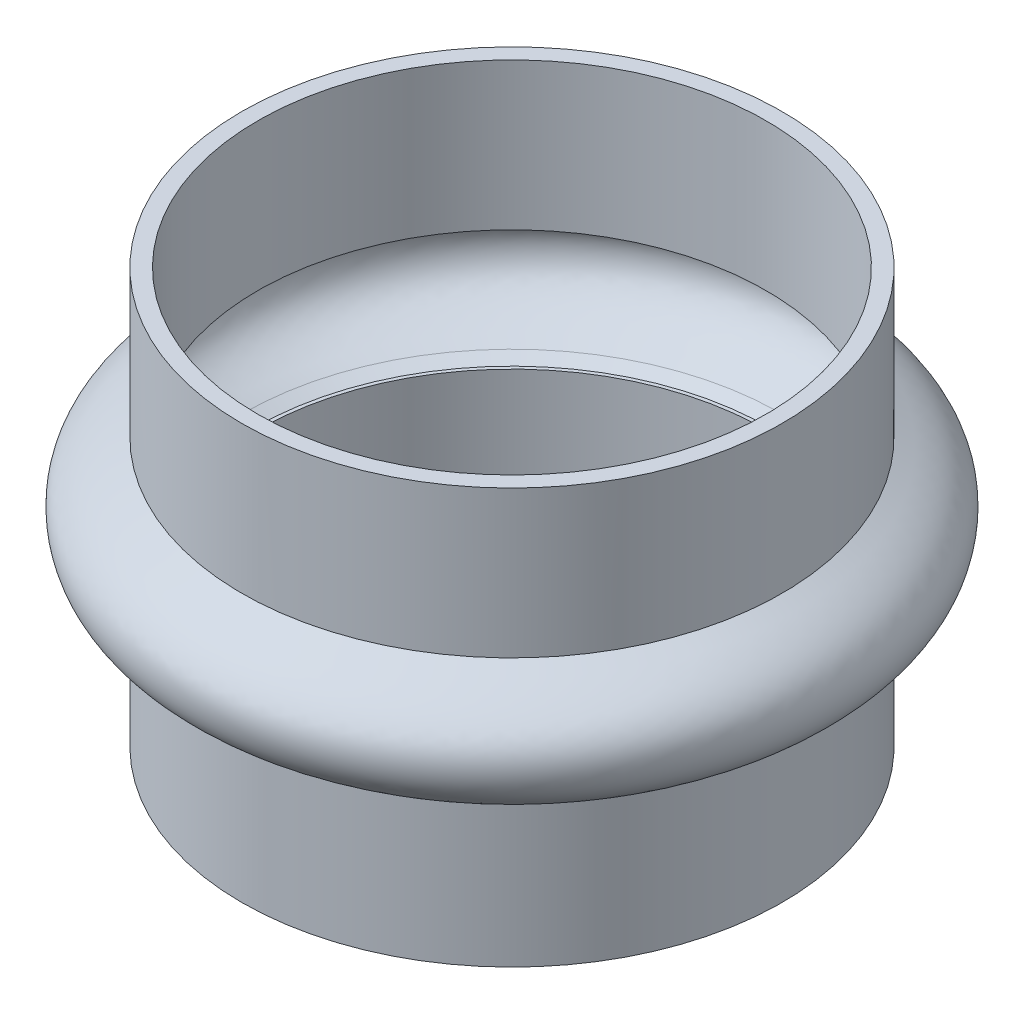
ISO-10303-21;
HEADER;
FILE_DESCRIPTION(('STEP AP214'),'2;1');
FILE_NAME('part.step','',(''),(''),'','','');
FILE_SCHEMA(('AUTOMOTIVE_DESIGN { 1 0 10303 214 1 1 1 1 }'));
ENDSEC;
DATA;
#1=APPLICATION_CONTEXT('core data for automotive mechanical design processes');
#2=APPLICATION_PROTOCOL_DEFINITION('international standard','automotive_design',2000,#1);
#3=PRODUCT_CONTEXT('',#1,'mechanical');
#4=PRODUCT('Part','Part','',(#3));
#5=PRODUCT_RELATED_PRODUCT_CATEGORY('part','',(#4));
#6=PRODUCT_DEFINITION_FORMATION('','',#4);
#7=PRODUCT_DEFINITION_CONTEXT('part definition',#1,'design');
#8=PRODUCT_DEFINITION('design','',#6,#7);
#9=PRODUCT_DEFINITION_SHAPE('','',#8);
#10=(LENGTH_UNIT() NAMED_UNIT(*) SI_UNIT(.MILLI.,.METRE.));
#11=(NAMED_UNIT(*) PLANE_ANGLE_UNIT() SI_UNIT($,.RADIAN.));
#12=(NAMED_UNIT(*) SI_UNIT($,.STERADIAN.) SOLID_ANGLE_UNIT());
#13=UNCERTAINTY_MEASURE_WITH_UNIT(LENGTH_MEASURE(1.E-05),#10,'distance_accuracy_value','');
#14=(GEOMETRIC_REPRESENTATION_CONTEXT(3) GLOBAL_UNCERTAINTY_ASSIGNED_CONTEXT((#13)) GLOBAL_UNIT_ASSIGNED_CONTEXT((#10,
#11,#12)) REPRESENTATION_CONTEXT('',''));
#15=CARTESIAN_POINT('',(0.,0.,0.));
#16=DIRECTION('',(0.,0.,1.));
#17=DIRECTION('',(1.,0.,0.));
#18=AXIS2_PLACEMENT_3D('',#15,#16,#17);
#19=CARTESIAN_POINT('',(7.32527885416046,63.4118839536714,0.));
#20=CARTESIAN_POINT('',(6.01113524448012,62.7300548837443,0.));
#21=CARTESIAN_POINT('',(2.97178340482834,61.4251647000728,0.));
#22=CARTESIAN_POINT('',(3.46335156981875,56.9126049959074,0.));
#23=CARTESIAN_POINT('',(5.94264008540045,55.867892062733,0.));
#24=CARTESIAN_POINT('',(7.13175859484,55.2111567601479,0.));
#25=B_SPLINE_CURVE_WITH_KNOTS('',3,(#19,#20,#21,#22,#23,#24),.UNSPECIFIED.,.F.,.F.,(4,1,1,4),
(0.,0.430000258288569,0.624673055244475,1.),.UNSPECIFIED.);
#26=CARTESIAN_POINT('',(25.6902788541605,76.5393428738392,0.));
#27=DIRECTION('',(0.,1.,0.));
#28=AXIS1_PLACEMENT('',#26,#27);
#29=SURFACE_OF_REVOLUTION('',#25,#28);
#30=CARTESIAN_POINT('',(25.6902788541605,55.211156760148,0.));
#31=DIRECTION('',(0.,1.,0.));
#32=DIRECTION('',(-1.,0.,0.));
#33=AXIS2_PLACEMENT_3D('',#30,#31,#32);
#34=CIRCLE('',#33,18.5585202593205);
#35=CARTESIAN_POINT('',(7.13175859484001,55.211156760148,0.));
#36=VERTEX_POINT('',#35);
#37=EDGE_CURVE('E10',#36,#36,#34,.T.);
#38=ORIENTED_EDGE('',*,*,#37,.T.);
#39=EDGE_LOOP('',(#38));
#40=FACE_BOUND('',#39,.T.);
#41=CARTESIAN_POINT('',(25.6902788541605,63.4118839536714,0.));
#42=DIRECTION('',(0.,1.,0.));
#43=DIRECTION('',(-1.,0.,0.));
#44=AXIS2_PLACEMENT_3D('',#41,#42,#43);
#45=CIRCLE('',#44,18.365);
#46=CARTESIAN_POINT('',(7.32527885416046,63.4118839536714,0.));
#47=VERTEX_POINT('',#46);
#48=EDGE_CURVE('E61',#47,#47,#45,.T.);
#49=ORIENTED_EDGE('',*,*,#48,.F.);
#50=EDGE_LOOP('',(#49));
#51=FACE_BOUND('',#50,.T.);
#52=ADVANCED_FACE('F37',(#40,#51),#29,.F.);
#53=CARTESIAN_POINT('',(8.16598021867365,55.211156760148,0.));
#54=DIRECTION('',(0.,-1.,0.));
#55=DIRECTION('',(1.,0.,0.));
#56=AXIS2_PLACEMENT_3D('',#53,#54,#55);
#57=PLANE('',#56);
#58=CARTESIAN_POINT('',(25.6902788541605,55.2111567601479,0.));
#59=DIRECTION('',(0.,1.,0.));
#60=DIRECTION('',(0.,0.,1.));
#61=AXIS2_PLACEMENT_3D('',#58,#59,#60);
#62=CIRCLE('',#61,18.365);
#63=CARTESIAN_POINT('',(25.6902788541605,55.2111567601479,18.365));
#64=VERTEX_POINT('',#63);
#65=EDGE_CURVE('E96',#64,#64,#62,.T.);
#66=ORIENTED_EDGE('',*,*,#65,.T.);
#67=EDGE_LOOP('',(#66));
#68=FACE_BOUND('',#67,.T.);
#69=ORIENTED_EDGE('',*,*,#37,.F.);
#70=EDGE_LOOP('',(#69));
#71=FACE_BOUND('',#70,.T.);
#72=ADVANCED_FACE('F86',(#68,#71),#57,.T.);
#73=CARTESIAN_POINT('',(25.6902788541605,55.211156760148,0.));
#74=DIRECTION('',(0.,1.,0.));
#75=DIRECTION('',(-1.,0.,0.));
#76=AXIS2_PLACEMENT_3D('',#73,#74,#75);
#77=CONICAL_SURFACE('',#76,17.5242986354868,1.0661985655365);
#78=CARTESIAN_POINT('',(25.6902788541605,55.6488412650065,0.));
#79=DIRECTION('',(0.,1.,0.));
#80=DIRECTION('',(-1.,0.,0.));
#81=AXIS2_PLACEMENT_3D('',#78,#79,#80);
#82=CIRCLE('',#81,18.3167925732629);
#83=CARTESIAN_POINT('',(7.37348628089757,55.6488412650065,0.));
#84=VERTEX_POINT('',#83);
#85=EDGE_CURVE('E50',#84,#84,#82,.T.);
#86=ORIENTED_EDGE('',*,*,#85,.T.);
#87=EDGE_LOOP('',(#86));
#88=FACE_BOUND('',#87,.T.);
#89=CARTESIAN_POINT('',(25.6902788541605,55.211156760148,0.));
#90=DIRECTION('',(0.,1.,0.));
#91=DIRECTION('',(-1.,0.,0.));
#92=AXIS2_PLACEMENT_3D('',#89,#90,#91);
#93=CIRCLE('',#92,17.5242986354868);
#94=CARTESIAN_POINT('',(8.16598021867365,55.211156760148,0.));
#95=VERTEX_POINT('',#94);
#96=EDGE_CURVE('E45',#95,#95,#93,.T.);
#97=ORIENTED_EDGE('',*,*,#96,.F.);
#98=EDGE_LOOP('',(#97));
#99=FACE_BOUND('',#98,.T.);
#100=ADVANCED_FACE('F82',(#88,#99),#77,.F.);
#101=CARTESIAN_POINT('',(7.37348628089757,55.6488412650065,0.));
#102=CARTESIAN_POINT('',(6.94927786526421,55.8831262752797,0.));
#103=CARTESIAN_POINT('',(6.08596344010193,56.3113793414857,0.));
#104=CARTESIAN_POINT('',(4.83183781803493,57.1065516861268,0.));
#105=CARTESIAN_POINT('',(3.98998944217818,58.0646968706636,0.));
#106=CARTESIAN_POINT('',(3.73463050414133,59.1781793514421,0.));
#107=CARTESIAN_POINT('',(3.84359558060863,60.0137583984932,0.));
#108=CARTESIAN_POINT('',(4.15954484014883,60.7257045834839,0.));
#109=CARTESIAN_POINT('',(4.95450233993011,61.5405908742814,0.));
#110=CARTESIAN_POINT('',(6.05410486957729,62.2018426288294,0.));
#111=CARTESIAN_POINT('',(6.94714467288609,62.6603874787557,0.));
#112=CARTESIAN_POINT('',(7.34999990981553,62.8614176513628,0.));
#113=CARTESIAN_POINT('',(7.55554955647946,62.9680648422606,0.));
#114=B_SPLINE_CURVE_WITH_KNOTS('',3,(#101,#102,#103,#104,#105,#106,#107,#108,#109,#110,#111,
#112,#113),.UNSPECIFIED.,.F.,.F.,(4,1,1,1,1,1,1,1,1,1,4),(0.,0.125,0.25,0.375,0.5,0.5625,0.625,
0.75,0.875,0.9375,1.),.UNSPECIFIED.);
#115=CARTESIAN_POINT('',(25.6902788541605,76.5393428738392,0.));
#116=DIRECTION('',(0.,1.,0.));
#117=AXIS1_PLACEMENT('',#115,#116);
#118=SURFACE_OF_REVOLUTION('',#114,#117);
#119=CARTESIAN_POINT('',(25.6902788541605,62.9680648422606,0.));
#120=DIRECTION('',(0.,1.,0.));
#121=DIRECTION('',(-1.,0.,0.));
#122=AXIS2_PLACEMENT_3D('',#119,#120,#121);
#123=CIRCLE('',#122,18.134729297681);
#124=CARTESIAN_POINT('',(7.55554955647946,62.9680648422606,0.));
#125=VERTEX_POINT('',#124);
#126=EDGE_CURVE('E55',#125,#125,#123,.T.);
#127=ORIENTED_EDGE('',*,*,#126,.T.);
#128=EDGE_LOOP('',(#127));
#129=FACE_BOUND('',#128,.T.);
#130=ORIENTED_EDGE('',*,*,#85,.F.);
#131=EDGE_LOOP('',(#130));
#132=FACE_BOUND('',#131,.T.);
#133=ADVANCED_FACE('F77',(#129,#132),#118,.F.);
#134=CARTESIAN_POINT('',(25.6902788541605,62.9680648422606,0.));
#135=DIRECTION('',(0.,-1.,0.));
#136=DIRECTION('',(1.,0.,0.));
#137=AXIS2_PLACEMENT_3D('',#134,#135,#136);
#138=CONICAL_SURFACE('',#137,18.134729297681,1.09219128631746);
#139=CARTESIAN_POINT('',(25.6902788541605,63.4118839536714,0.));
#140=DIRECTION('',(0.,1.,0.));
#141=DIRECTION('',(0.,0.,1.));
#142=AXIS2_PLACEMENT_3D('',#139,#140,#141);
#143=CIRCLE('',#142,17.2793212858505);
#144=CARTESIAN_POINT('',(25.6902788541605,63.4118839536714,17.2793212858505));
#145=VERTEX_POINT('',#144);
#146=EDGE_CURVE('E105',#145,#145,#143,.T.);
#147=ORIENTED_EDGE('',*,*,#146,.T.);
#148=EDGE_LOOP('',(#147));
#149=FACE_BOUND('',#148,.T.);
#150=ORIENTED_EDGE('',*,*,#126,.F.);
#151=EDGE_LOOP('',(#150));
#152=FACE_BOUND('',#151,.T.);
#153=ADVANCED_FACE('F81',(#149,#152),#138,.F.);
#154=CARTESIAN_POINT('',(25.6902788541605,73.4118839536714,0.));
#155=DIRECTION('',(0.,1.,0.));
#156=DIRECTION('',(0.,0.,1.));
#157=AXIS2_PLACEMENT_3D('',#154,#155,#156);
#158=PLANE('',#157);
#159=CARTESIAN_POINT('',(25.6902788541605,73.4118839536714,0.));
#160=DIRECTION('',(0.,1.,0.));
#161=DIRECTION('',(0.,0.,1.));
#162=AXIS2_PLACEMENT_3D('',#159,#160,#161);
#163=CIRCLE('',#162,18.365);
#164=CARTESIAN_POINT('',(25.6902788541605,73.4118839536714,18.365));
#165=VERTEX_POINT('',#164);
#166=EDGE_CURVE('E65',#165,#165,#163,.T.);
#167=ORIENTED_EDGE('',*,*,#166,.T.);
#168=EDGE_LOOP('',(#167));
#169=FACE_BOUND('',#168,.T.);
#170=CARTESIAN_POINT('',(25.6902788541605,73.4118839536714,0.));
#171=DIRECTION('',(0.,1.,0.));
#172=DIRECTION('',(0.,0.,1.));
#173=AXIS2_PLACEMENT_3D('',#170,#171,#172);
#174=CIRCLE('',#173,17.2793212858505);
#175=CARTESIAN_POINT('',(25.6902788541605,73.4118839536714,17.2793212858505));
#176=VERTEX_POINT('',#175);
#177=EDGE_CURVE('E112',#176,#176,#174,.T.);
#178=ORIENTED_EDGE('',*,*,#177,.F.);
#179=EDGE_LOOP('',(#178));
#180=FACE_BOUND('',#179,.T.);
#181=ADVANCED_FACE('F122',(#169,#180),#158,.T.);
#182=CARTESIAN_POINT('',(25.6902788541605,73.4118839536714,0.));
#183=DIRECTION('',(0.,-1.,0.));
#184=DIRECTION('',(0.,0.,-1.));
#185=AXIS2_PLACEMENT_3D('',#182,#183,#184);
#186=CYLINDRICAL_SURFACE('',#185,18.365);
#187=ORIENTED_EDGE('',*,*,#166,.F.);
#188=EDGE_LOOP('',(#187));
#189=FACE_BOUND('',#188,.T.);
#190=ORIENTED_EDGE('',*,*,#48,.T.);
#191=EDGE_LOOP('',(#190));
#192=FACE_BOUND('',#191,.T.);
#193=ADVANCED_FACE('F125',(#189,#192),#186,.T.);
#194=CARTESIAN_POINT('',(25.6902788541605,73.4118839536714,0.));
#195=DIRECTION('',(0.,-1.,0.));
#196=DIRECTION('',(0.,0.,-1.));
#197=AXIS2_PLACEMENT_3D('',#194,#195,#196);
#198=CYLINDRICAL_SURFACE('',#197,17.2793212858505);
#199=ORIENTED_EDGE('',*,*,#177,.T.);
#200=EDGE_LOOP('',(#199));
#201=FACE_BOUND('',#200,.T.);
#202=ORIENTED_EDGE('',*,*,#146,.F.);
#203=EDGE_LOOP('',(#202));
#204=FACE_BOUND('',#203,.T.);
#205=ADVANCED_FACE('F128',(#201,#204),#198,.F.);
#206=CARTESIAN_POINT('',(25.6902788541605,55.2111567601479,0.));
#207=DIRECTION('',(0.,-1.,0.));
#208=DIRECTION('',(0.,0.,1.));
#209=AXIS2_PLACEMENT_3D('',#206,#207,#208);
#210=PLANE('',#209);
#211=CARTESIAN_POINT('',(25.6902788541605,55.2111567601479,0.));
#212=DIRECTION('',(0.,1.,0.));
#213=DIRECTION('',(0.,0.,1.));
#214=AXIS2_PLACEMENT_3D('',#211,#212,#213);
#215=CIRCLE('',#214,17.2793212858505);
#216=CARTESIAN_POINT('',(25.6902788541605,55.2111567601479,17.2793212858505));
#217=VERTEX_POINT('',#216);
#218=EDGE_CURVE('E108',#217,#217,#215,.T.);
#219=ORIENTED_EDGE('',*,*,#218,.F.);
#220=EDGE_LOOP('',(#219));
#221=FACE_BOUND('',#220,.T.);
#222=ORIENTED_EDGE('',*,*,#96,.T.);
#223=EDGE_LOOP('',(#222));
#224=FACE_BOUND('',#223,.T.);
#225=ADVANCED_FACE('F135',(#221,#224),#210,.F.);
#226=CARTESIAN_POINT('',(25.6902788541605,45.2111567601479,0.));
#227=DIRECTION('',(0.,1.,0.));
#228=DIRECTION('',(0.,0.,1.));
#229=AXIS2_PLACEMENT_3D('',#226,#227,#228);
#230=CYLINDRICAL_SURFACE('',#229,18.365);
#231=CARTESIAN_POINT('',(25.6902788541605,45.2111567601479,0.));
#232=DIRECTION('',(0.,1.,0.));
#233=DIRECTION('',(0.,0.,1.));
#234=AXIS2_PLACEMENT_3D('',#231,#232,#233);
#235=CIRCLE('',#234,18.365);
#236=CARTESIAN_POINT('',(25.6902788541605,45.2111567601479,18.365));
#237=VERTEX_POINT('',#236);
#238=EDGE_CURVE('E99',#237,#237,#235,.T.);
#239=ORIENTED_EDGE('',*,*,#238,.T.);
#240=EDGE_LOOP('',(#239));
#241=FACE_BOUND('',#240,.T.);
#242=ORIENTED_EDGE('',*,*,#65,.F.);
#243=EDGE_LOOP('',(#242));
#244=FACE_BOUND('',#243,.T.);
#245=ADVANCED_FACE('F140',(#241,#244),#230,.T.);
#246=CARTESIAN_POINT('',(25.6902788541605,45.2111567601479,0.));
#247=DIRECTION('',(0.,-1.,0.));
#248=DIRECTION('',(0.,0.,1.));
#249=AXIS2_PLACEMENT_3D('',#246,#247,#248);
#250=PLANE('',#249);
#251=CARTESIAN_POINT('',(25.6902788541605,45.2111567601479,0.));
#252=DIRECTION('',(0.,1.,0.));
#253=DIRECTION('',(0.,0.,1.));
#254=AXIS2_PLACEMENT_3D('',#251,#252,#253);
#255=CIRCLE('',#254,17.2793212858505);
#256=CARTESIAN_POINT('',(25.6902788541605,45.2111567601479,17.2793212858505));
#257=VERTEX_POINT('',#256);
#258=EDGE_CURVE('E100',#257,#257,#255,.T.);
#259=ORIENTED_EDGE('',*,*,#258,.T.);
#260=EDGE_LOOP('',(#259));
#261=FACE_BOUND('',#260,.T.);
#262=ORIENTED_EDGE('',*,*,#238,.F.);
#263=EDGE_LOOP('',(#262));
#264=FACE_BOUND('',#263,.T.);
#265=ADVANCED_FACE('F143',(#261,#264),#250,.T.);
#266=CARTESIAN_POINT('',(25.6902788541605,45.2111567601479,0.));
#267=DIRECTION('',(0.,1.,0.));
#268=DIRECTION('',(0.,0.,1.));
#269=AXIS2_PLACEMENT_3D('',#266,#267,#268);
#270=CYLINDRICAL_SURFACE('',#269,17.2793212858505);
#271=ORIENTED_EDGE('',*,*,#258,.F.);
#272=EDGE_LOOP('',(#271));
#273=FACE_BOUND('',#272,.T.);
#274=ORIENTED_EDGE('',*,*,#218,.T.);
#275=EDGE_LOOP('',(#274));
#276=FACE_BOUND('',#275,.T.);
#277=ADVANCED_FACE('F150',(#273,#276),#270,.F.);
#278=CLOSED_SHELL('',(#52,#72,#100,#133,#153,#181,#193,#205,#225,#245,#265,#277));
#279=MANIFOLD_SOLID_BREP('B2',#278);
#280=ADVANCED_BREP_SHAPE_REPRESENTATION('',(#18,#279),#14);
#281=SHAPE_DEFINITION_REPRESENTATION(#9,#280);
ENDSEC;
END-ISO-10303-21;
